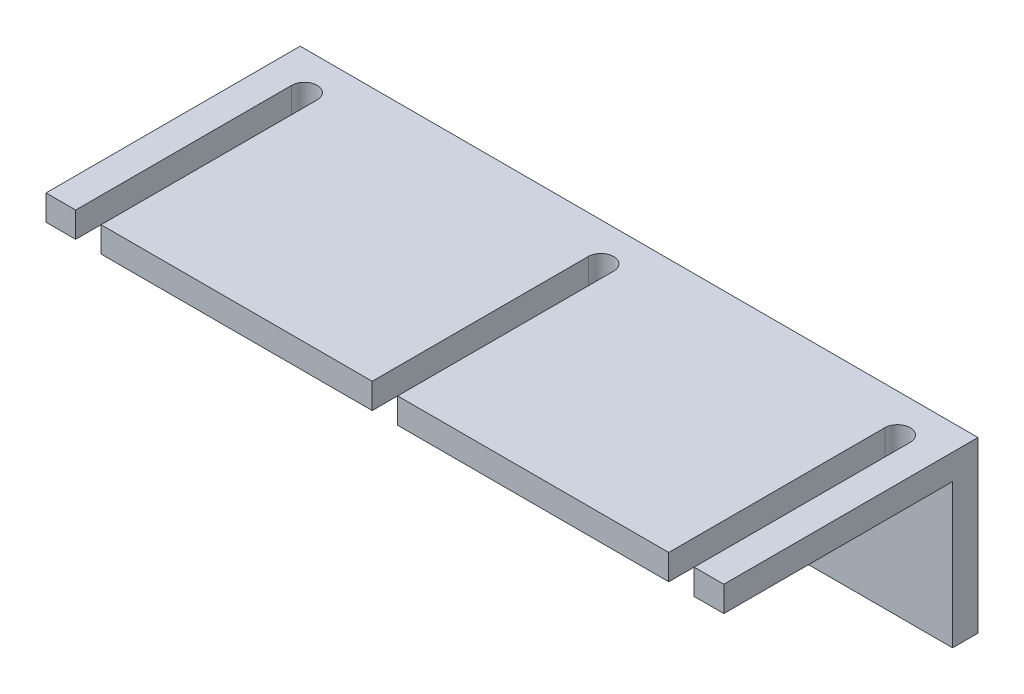
ISO-10303-21;
HEADER;
FILE_DESCRIPTION(('STEP AP214'),'2;1');
FILE_NAME('part.step','',(''),(''),'','','');
FILE_SCHEMA(('AUTOMOTIVE_DESIGN { 1 0 10303 214 1 1 1 1 }'));
ENDSEC;
DATA;
#1=APPLICATION_CONTEXT('core data for automotive mechanical design processes');
#2=APPLICATION_PROTOCOL_DEFINITION('international standard','automotive_design',2000,#1);
#3=PRODUCT_CONTEXT('',#1,'mechanical');
#4=PRODUCT('Part','Part','',(#3));
#5=PRODUCT_RELATED_PRODUCT_CATEGORY('part','',(#4));
#6=PRODUCT_DEFINITION_FORMATION('','',#4);
#7=PRODUCT_DEFINITION_CONTEXT('part definition',#1,'design');
#8=PRODUCT_DEFINITION('design','',#6,#7);
#9=PRODUCT_DEFINITION_SHAPE('','',#8);
#10=(LENGTH_UNIT() NAMED_UNIT(*) SI_UNIT(.MILLI.,.METRE.));
#11=(NAMED_UNIT(*) PLANE_ANGLE_UNIT() SI_UNIT($,.RADIAN.));
#12=(NAMED_UNIT(*) SI_UNIT($,.STERADIAN.) SOLID_ANGLE_UNIT());
#13=UNCERTAINTY_MEASURE_WITH_UNIT(LENGTH_MEASURE(1.E-05),#10,'distance_accuracy_value','');
#14=(GEOMETRIC_REPRESENTATION_CONTEXT(3) GLOBAL_UNCERTAINTY_ASSIGNED_CONTEXT((#13)) GLOBAL_UNIT_ASSIGNED_CONTEXT((#10,
#11,#12)) REPRESENTATION_CONTEXT('',''));
#15=CARTESIAN_POINT('',(0.,0.,0.));
#16=DIRECTION('',(0.,0.,1.));
#17=DIRECTION('',(1.,0.,0.));
#18=AXIS2_PLACEMENT_3D('',#15,#16,#17);
#19=CARTESIAN_POINT('',(-40.,10.,3.));
#20=DIRECTION('',(0.,-1.,0.));
#21=DIRECTION('',(0.,0.,-1.));
#22=AXIS2_PLACEMENT_3D('',#19,#20,#21);
#23=PLANE('',#22);
#24=DIRECTION('',(0.,0.,1.));
#25=VECTOR('',#24,1.);
#26=CARTESIAN_POINT('',(-33.5,10.,0.));
#27=LINE('',#26,#25);
#28=CARTESIAN_POINT('',(-33.5,10.,4.50000000000001));
#29=VERTEX_POINT('',#28);
#30=CARTESIAN_POINT('',(-33.5,10.,30.));
#31=VERTEX_POINT('',#30);
#32=EDGE_CURVE('E211',#29,#31,#27,.T.);
#33=ORIENTED_EDGE('',*,*,#32,.T.);
#34=DIRECTION('',(1.,0.,0.));
#35=VECTOR('',#34,1.);
#36=CARTESIAN_POINT('',(-40.,10.,30.));
#37=LINE('',#36,#35);
#38=CARTESIAN_POINT('',(-1.5,10.,30.));
#39=VERTEX_POINT('',#38);
#40=EDGE_CURVE('E250',#31,#39,#37,.T.);
#41=ORIENTED_EDGE('',*,*,#40,.T.);
#42=DIRECTION('',(0.,0.,1.));
#43=VECTOR('',#42,1.);
#44=CARTESIAN_POINT('',(-1.5,10.,0.));
#45=LINE('',#44,#43);
#46=CARTESIAN_POINT('',(-1.5,10.,4.50000000000001));
#47=VERTEX_POINT('',#46);
#48=EDGE_CURVE('E223',#47,#39,#45,.T.);
#49=ORIENTED_EDGE('',*,*,#48,.F.);
#50=CARTESIAN_POINT('',(0.,10.,4.50000000000001));
#51=DIRECTION('',(0.,1.,0.));
#52=DIRECTION('',(0.,0.,1.));
#53=AXIS2_PLACEMENT_3D('',#50,#51,#52);
#54=CIRCLE('',#53,1.5);
#55=CARTESIAN_POINT('',(1.5,10.,4.50000000000001));
#56=VERTEX_POINT('',#55);
#57=EDGE_CURVE('E201',#47,#56,#54,.F.);
#58=ORIENTED_EDGE('',*,*,#57,.T.);
#59=DIRECTION('',(0.,0.,-1.));
#60=VECTOR('',#59,1.);
#61=CARTESIAN_POINT('',(1.5,10.,0.));
#62=LINE('',#61,#60);
#63=CARTESIAN_POINT('',(1.5,10.,30.));
#64=VERTEX_POINT('',#63);
#65=EDGE_CURVE('E225',#64,#56,#62,.T.);
#66=ORIENTED_EDGE('',*,*,#65,.F.);
#67=CARTESIAN_POINT('',(33.5,10.,30.));
#68=VERTEX_POINT('',#67);
#69=EDGE_CURVE('E196',#64,#68,#37,.T.);
#70=ORIENTED_EDGE('',*,*,#69,.T.);
#71=DIRECTION('',(0.,0.,-1.));
#72=VECTOR('',#71,1.);
#73=CARTESIAN_POINT('',(33.5,10.,0.));
#74=LINE('',#73,#72);
#75=CARTESIAN_POINT('',(33.5,10.,4.50000000000001));
#76=VERTEX_POINT('',#75);
#77=EDGE_CURVE('E176',#68,#76,#74,.T.);
#78=ORIENTED_EDGE('',*,*,#77,.T.);
#79=CARTESIAN_POINT('',(35.,10.,4.50000000000001));
#80=DIRECTION('',(0.,1.,0.));
#81=DIRECTION('',(0.,0.,1.));
#82=AXIS2_PLACEMENT_3D('',#79,#80,#81);
#83=CIRCLE('',#82,1.5);
#84=CARTESIAN_POINT('',(36.5,10.,4.50000000000001));
#85=VERTEX_POINT('',#84);
#86=EDGE_CURVE('E183',#76,#85,#83,.F.);
#87=ORIENTED_EDGE('',*,*,#86,.T.);
#88=DIRECTION('',(0.,0.,1.));
#89=VECTOR('',#88,1.);
#90=CARTESIAN_POINT('',(36.5,10.,0.));
#91=LINE('',#90,#89);
#92=CARTESIAN_POINT('',(36.5,10.,30.));
#93=VERTEX_POINT('',#92);
#94=EDGE_CURVE('E180',#85,#93,#91,.T.);
#95=ORIENTED_EDGE('',*,*,#94,.T.);
#96=CARTESIAN_POINT('',(40.,10.,30.));
#97=VERTEX_POINT('',#96);
#98=EDGE_CURVE('E231',#93,#97,#37,.T.);
#99=ORIENTED_EDGE('',*,*,#98,.T.);
#100=DIRECTION('',(0.,0.,-1.));
#101=VECTOR('',#100,1.);
#102=CARTESIAN_POINT('',(40.,10.,3.));
#103=LINE('',#102,#101);
#104=CARTESIAN_POINT('',(40.,10.,0.));
#105=VERTEX_POINT('',#104);
#106=EDGE_CURVE('E296',#97,#105,#103,.T.);
#107=ORIENTED_EDGE('',*,*,#106,.T.);
#108=DIRECTION('',(-1.,0.,0.));
#109=VECTOR('',#108,1.);
#110=CARTESIAN_POINT('',(-40.,10.,0.));
#111=LINE('',#110,#109);
#112=CARTESIAN_POINT('',(-40.,10.,0.));
#113=VERTEX_POINT('',#112);
#114=EDGE_CURVE('E283',#105,#113,#111,.T.);
#115=ORIENTED_EDGE('',*,*,#114,.T.);
#116=DIRECTION('',(0.,0.,-1.));
#117=VECTOR('',#116,1.);
#118=CARTESIAN_POINT('',(-40.,10.,3.));
#119=LINE('',#118,#117);
#120=CARTESIAN_POINT('',(-40.,10.,30.));
#121=VERTEX_POINT('',#120);
#122=EDGE_CURVE('E293',#121,#113,#119,.T.);
#123=ORIENTED_EDGE('',*,*,#122,.F.);
#124=CARTESIAN_POINT('',(-36.5,10.,30.));
#125=VERTEX_POINT('',#124);
#126=EDGE_CURVE('E239',#121,#125,#37,.T.);
#127=ORIENTED_EDGE('',*,*,#126,.T.);
#128=DIRECTION('',(0.,0.,-1.));
#129=VECTOR('',#128,1.);
#130=CARTESIAN_POINT('',(-36.5,10.,0.));
#131=LINE('',#130,#129);
#132=CARTESIAN_POINT('',(-36.5,10.,4.50000000000001));
#133=VERTEX_POINT('',#132);
#134=EDGE_CURVE('E208',#125,#133,#131,.T.);
#135=ORIENTED_EDGE('',*,*,#134,.T.);
#136=CARTESIAN_POINT('',(-35.,10.,4.50000000000001));
#137=DIRECTION('',(0.,1.,0.));
#138=DIRECTION('',(0.,0.,1.));
#139=AXIS2_PLACEMENT_3D('',#136,#137,#138);
#140=CIRCLE('',#139,1.5);
#141=EDGE_CURVE('E205',#133,#29,#140,.F.);
#142=ORIENTED_EDGE('',*,*,#141,.T.);
#143=EDGE_LOOP('',(#33,#41,#49,#58,#66,#70,#78,#87,#95,#99,#107,#115,#123,#127,#135,#142));
#144=FACE_BOUND('',#143,.T.);
#145=ADVANCED_FACE('F41',(#144),#23,.F.);
#146=CARTESIAN_POINT('',(-40.,7.,30.));
#147=DIRECTION('',(0.,0.,1.));
#148=DIRECTION('',(1.,0.,0.));
#149=AXIS2_PLACEMENT_3D('',#146,#147,#148);
#150=PLANE('',#149);
#151=ORIENTED_EDGE('',*,*,#40,.F.);
#152=DIRECTION('',(0.,1.,0.));
#153=VECTOR('',#152,1.);
#154=CARTESIAN_POINT('',(-33.5,-10.,30.));
#155=LINE('',#154,#153);
#156=CARTESIAN_POINT('',(-33.5,7.,30.));
#157=VERTEX_POINT('',#156);
#158=EDGE_CURVE('E215',#157,#31,#155,.T.);
#159=ORIENTED_EDGE('',*,*,#158,.F.);
#160=DIRECTION('',(1.,0.,0.));
#161=VECTOR('',#160,1.);
#162=CARTESIAN_POINT('',(-40.,7.,30.));
#163=LINE('',#162,#161);
#164=CARTESIAN_POINT('',(-1.49999999999999,7.,30.));
#165=VERTEX_POINT('',#164);
#166=EDGE_CURVE('E244',#157,#165,#163,.T.);
#167=ORIENTED_EDGE('',*,*,#166,.T.);
#168=DIRECTION('',(0.,1.,0.));
#169=VECTOR('',#168,1.);
#170=CARTESIAN_POINT('',(-1.5,-10.,30.));
#171=LINE('',#170,#169);
#172=EDGE_CURVE('E64',#165,#39,#171,.T.);
#173=ORIENTED_EDGE('',*,*,#172,.T.);
#174=EDGE_LOOP('',(#151,#159,#167,#173));
#175=FACE_BOUND('',#174,.T.);
#176=ADVANCED_FACE('F374',(#175),#150,.T.);
#177=CARTESIAN_POINT('',(-40.,7.,30.));
#178=VERTEX_POINT('',#177);
#179=CARTESIAN_POINT('',(-36.5,7.,30.));
#180=VERTEX_POINT('',#179);
#181=EDGE_CURVE('E240',#178,#180,#163,.T.);
#182=ORIENTED_EDGE('',*,*,#181,.T.);
#183=DIRECTION('',(0.,1.,0.));
#184=VECTOR('',#183,1.);
#185=CARTESIAN_POINT('',(-36.5,-10.,30.));
#186=LINE('',#185,#184);
#187=EDGE_CURVE('E217',#180,#125,#186,.T.);
#188=ORIENTED_EDGE('',*,*,#187,.T.);
#189=ORIENTED_EDGE('',*,*,#126,.F.);
#190=DIRECTION('',(0.,1.,0.));
#191=VECTOR('',#190,1.);
#192=CARTESIAN_POINT('',(-40.,7.,30.));
#193=LINE('',#192,#191);
#194=EDGE_CURVE('E247',#178,#121,#193,.T.);
#195=ORIENTED_EDGE('',*,*,#194,.F.);
#196=EDGE_LOOP('',(#182,#188,#189,#195));
#197=FACE_BOUND('',#196,.T.);
#198=ADVANCED_FACE('F376',(#197),#150,.T.);
#199=ORIENTED_EDGE('',*,*,#98,.F.);
#200=DIRECTION('',(0.,1.,0.));
#201=VECTOR('',#200,1.);
#202=CARTESIAN_POINT('',(36.5,-10.,30.));
#203=LINE('',#202,#201);
#204=CARTESIAN_POINT('',(36.5,7.,30.));
#205=VERTEX_POINT('',#204);
#206=EDGE_CURVE('E202',#205,#93,#203,.T.);
#207=ORIENTED_EDGE('',*,*,#206,.F.);
#208=CARTESIAN_POINT('',(40.,7.,30.));
#209=VERTEX_POINT('',#208);
#210=EDGE_CURVE('E238',#205,#209,#163,.T.);
#211=ORIENTED_EDGE('',*,*,#210,.T.);
#212=DIRECTION('',(0.,1.,0.));
#213=VECTOR('',#212,1.);
#214=CARTESIAN_POINT('',(40.,7.,30.));
#215=LINE('',#214,#213);
#216=EDGE_CURVE('E251',#209,#97,#215,.T.);
#217=ORIENTED_EDGE('',*,*,#216,.T.);
#218=EDGE_LOOP('',(#199,#207,#211,#217));
#219=FACE_BOUND('',#218,.T.);
#220=ADVANCED_FACE('F345',(#219),#150,.T.);
#221=CARTESIAN_POINT('',(1.5,7.,30.));
#222=VERTEX_POINT('',#221);
#223=CARTESIAN_POINT('',(33.5,7.,30.));
#224=VERTEX_POINT('',#223);
#225=EDGE_CURVE('E335',#222,#224,#163,.T.);
#226=ORIENTED_EDGE('',*,*,#225,.T.);
#227=DIRECTION('',(0.,1.,0.));
#228=VECTOR('',#227,1.);
#229=CARTESIAN_POINT('',(33.5,-10.,30.));
#230=LINE('',#229,#228);
#231=EDGE_CURVE('E56',#224,#68,#230,.T.);
#232=ORIENTED_EDGE('',*,*,#231,.T.);
#233=ORIENTED_EDGE('',*,*,#69,.F.);
#234=DIRECTION('',(0.,1.,0.));
#235=VECTOR('',#234,1.);
#236=CARTESIAN_POINT('',(1.5,-10.,30.));
#237=LINE('',#236,#235);
#238=EDGE_CURVE('E232',#222,#64,#237,.T.);
#239=ORIENTED_EDGE('',*,*,#238,.F.);
#240=EDGE_LOOP('',(#226,#232,#233,#239));
#241=FACE_BOUND('',#240,.T.);
#242=ADVANCED_FACE('F378',(#241),#150,.T.);
#243=CARTESIAN_POINT('',(0.,7.,0.));
#244=DIRECTION('',(0.,1.,0.));
#245=DIRECTION('',(0.,0.,1.));
#246=AXIS2_PLACEMENT_3D('',#243,#244,#245);
#247=PLANE('',#246);
#248=DIRECTION('',(0.,0.,1.));
#249=VECTOR('',#248,1.);
#250=CARTESIAN_POINT('',(-33.5,7.,0.));
#251=LINE('',#250,#249);
#252=CARTESIAN_POINT('',(-33.5,7.,4.50000000000001));
#253=VERTEX_POINT('',#252);
#254=EDGE_CURVE('E11',#253,#157,#251,.T.);
#255=ORIENTED_EDGE('',*,*,#254,.F.);
#256=CARTESIAN_POINT('',(-35.,7.,4.50000000000001));
#257=DIRECTION('',(0.,1.,0.));
#258=DIRECTION('',(0.,0.,1.));
#259=AXIS2_PLACEMENT_3D('',#256,#257,#258);
#260=CIRCLE('',#259,1.5);
#261=CARTESIAN_POINT('',(-35.,7.,3.));
#262=VERTEX_POINT('',#261);
#263=EDGE_CURVE('E49',#262,#253,#260,.F.);
#264=ORIENTED_EDGE('',*,*,#263,.F.);
#265=DIRECTION('',(-1.,0.,0.));
#266=VECTOR('',#265,1.);
#267=CARTESIAN_POINT('',(0.,7.,3.));
#268=LINE('',#267,#266);
#269=CARTESIAN_POINT('',(0.,7.,3.));
#270=VERTEX_POINT('',#269);
#271=EDGE_CURVE('E614',#270,#262,#268,.T.);
#272=ORIENTED_EDGE('',*,*,#271,.F.);
#273=CARTESIAN_POINT('',(0.,7.,4.50000000000001));
#274=DIRECTION('',(0.,1.,0.));
#275=DIRECTION('',(0.,0.,1.));
#276=AXIS2_PLACEMENT_3D('',#273,#274,#275);
#277=CIRCLE('',#276,1.5);
#278=CARTESIAN_POINT('',(-1.5,7.,4.50000000000001));
#279=VERTEX_POINT('',#278);
#280=EDGE_CURVE('E301',#279,#270,#277,.F.);
#281=ORIENTED_EDGE('',*,*,#280,.F.);
#282=DIRECTION('',(0.,0.,1.));
#283=VECTOR('',#282,1.);
#284=CARTESIAN_POINT('',(-1.5,7.,0.));
#285=LINE('',#284,#283);
#286=EDGE_CURVE('E299',#279,#165,#285,.T.);
#287=ORIENTED_EDGE('',*,*,#286,.T.);
#288=ORIENTED_EDGE('',*,*,#166,.F.);
#289=EDGE_LOOP('',(#255,#264,#272,#281,#287,#288));
#290=FACE_BOUND('',#289,.T.);
#291=ADVANCED_FACE('F331',(#290),#247,.F.);
#292=CARTESIAN_POINT('',(-36.5,7.,4.50000000000001));
#293=VERTEX_POINT('',#292);
#294=EDGE_CURVE('E314',#293,#262,#260,.F.);
#295=ORIENTED_EDGE('',*,*,#294,.F.);
#296=DIRECTION('',(0.,0.,-1.));
#297=VECTOR('',#296,1.);
#298=CARTESIAN_POINT('',(-36.5,7.,0.));
#299=LINE('',#298,#297);
#300=EDGE_CURVE('E313',#180,#293,#299,.T.);
#301=ORIENTED_EDGE('',*,*,#300,.F.);
#302=ORIENTED_EDGE('',*,*,#181,.F.);
#303=DIRECTION('',(0.,0.,1.));
#304=VECTOR('',#303,1.);
#305=CARTESIAN_POINT('',(-40.,7.,0.));
#306=LINE('',#305,#304);
#307=CARTESIAN_POINT('',(-40.,7.,3.));
#308=VERTEX_POINT('',#307);
#309=EDGE_CURVE('E236',#308,#178,#306,.T.);
#310=ORIENTED_EDGE('',*,*,#309,.F.);
#311=EDGE_CURVE('E254',#262,#308,#268,.T.);
#312=ORIENTED_EDGE('',*,*,#311,.F.);
#313=EDGE_LOOP('',(#295,#301,#302,#310,#312));
#314=FACE_BOUND('',#313,.T.);
#315=ADVANCED_FACE('F391',(#314),#247,.F.);
#316=DIRECTION('',(0.,0.,1.));
#317=VECTOR('',#316,1.);
#318=CARTESIAN_POINT('',(36.5,7.,0.));
#319=LINE('',#318,#317);
#320=CARTESIAN_POINT('',(36.5,7.,4.50000000000001));
#321=VERTEX_POINT('',#320);
#322=EDGE_CURVE('E311',#321,#205,#319,.T.);
#323=ORIENTED_EDGE('',*,*,#322,.F.);
#324=CARTESIAN_POINT('',(35.,7.,4.50000000000001));
#325=DIRECTION('',(0.,1.,0.));
#326=DIRECTION('',(0.,0.,1.));
#327=AXIS2_PLACEMENT_3D('',#324,#325,#326);
#328=CIRCLE('',#327,1.5);
#329=CARTESIAN_POINT('',(35.,7.,3.));
#330=VERTEX_POINT('',#329);
#331=EDGE_CURVE('E310',#330,#321,#328,.F.);
#332=ORIENTED_EDGE('',*,*,#331,.F.);
#333=CARTESIAN_POINT('',(40.,7.,3.));
#334=VERTEX_POINT('',#333);
#335=EDGE_CURVE('E257',#334,#330,#268,.T.);
#336=ORIENTED_EDGE('',*,*,#335,.F.);
#337=DIRECTION('',(0.,0.,-1.));
#338=VECTOR('',#337,1.);
#339=CARTESIAN_POINT('',(40.,7.,0.));
#340=LINE('',#339,#338);
#341=EDGE_CURVE('E243',#209,#334,#340,.T.);
#342=ORIENTED_EDGE('',*,*,#341,.F.);
#343=ORIENTED_EDGE('',*,*,#210,.F.);
#344=EDGE_LOOP('',(#323,#332,#336,#342,#343));
#345=FACE_BOUND('',#344,.T.);
#346=ADVANCED_FACE('F353',(#345),#247,.F.);
#347=CARTESIAN_POINT('',(33.5,7.,4.50000000000001));
#348=VERTEX_POINT('',#347);
#349=EDGE_CURVE('E308',#348,#330,#328,.F.);
#350=ORIENTED_EDGE('',*,*,#349,.F.);
#351=DIRECTION('',(0.,0.,-1.));
#352=VECTOR('',#351,1.);
#353=CARTESIAN_POINT('',(33.5,7.,0.));
#354=LINE('',#353,#352);
#355=EDGE_CURVE('E177',#224,#348,#354,.T.);
#356=ORIENTED_EDGE('',*,*,#355,.F.);
#357=ORIENTED_EDGE('',*,*,#225,.F.);
#358=DIRECTION('',(0.,0.,-1.));
#359=VECTOR('',#358,1.);
#360=CARTESIAN_POINT('',(1.5,7.,0.));
#361=LINE('',#360,#359);
#362=CARTESIAN_POINT('',(1.5,7.,4.50000000000001));
#363=VERTEX_POINT('',#362);
#364=EDGE_CURVE('E304',#222,#363,#361,.T.);
#365=ORIENTED_EDGE('',*,*,#364,.T.);
#366=EDGE_CURVE('E303',#270,#363,#277,.F.);
#367=ORIENTED_EDGE('',*,*,#366,.F.);
#368=EDGE_CURVE('E261',#330,#270,#268,.T.);
#369=ORIENTED_EDGE('',*,*,#368,.F.);
#370=EDGE_LOOP('',(#350,#356,#357,#365,#367,#369));
#371=FACE_BOUND('',#370,.T.);
#372=ADVANCED_FACE('F392',(#371),#247,.F.);
#373=CARTESIAN_POINT('',(0.,0.,3.));
#374=DIRECTION('',(0.,0.,1.));
#375=DIRECTION('',(1.,0.,0.));
#376=AXIS2_PLACEMENT_3D('',#373,#374,#375);
#377=PLANE('',#376);
#378=DIRECTION('',(1.,0.,0.));
#379=VECTOR('',#378,1.);
#380=CARTESIAN_POINT('',(-40.,-10.,3.));
#381=LINE('',#380,#379);
#382=CARTESIAN_POINT('',(-40.,-10.,3.));
#383=VERTEX_POINT('',#382);
#384=CARTESIAN_POINT('',(40.,-10.,3.));
#385=VERTEX_POINT('',#384);
#386=EDGE_CURVE('E279',#383,#385,#381,.T.);
#387=ORIENTED_EDGE('',*,*,#386,.T.);
#388=DIRECTION('',(0.,1.,0.));
#389=VECTOR('',#388,1.);
#390=CARTESIAN_POINT('',(40.,10.,3.));
#391=LINE('',#390,#389);
#392=EDGE_CURVE('E274',#385,#334,#391,.T.);
#393=ORIENTED_EDGE('',*,*,#392,.T.);
#394=ORIENTED_EDGE('',*,*,#335,.T.);
#395=ORIENTED_EDGE('',*,*,#368,.T.);
#396=ORIENTED_EDGE('',*,*,#271,.T.);
#397=ORIENTED_EDGE('',*,*,#311,.T.);
#398=DIRECTION('',(0.,-1.,0.));
#399=VECTOR('',#398,1.);
#400=CARTESIAN_POINT('',(-40.,10.,3.));
#401=LINE('',#400,#399);
#402=EDGE_CURVE('E276',#308,#383,#401,.T.);
#403=ORIENTED_EDGE('',*,*,#402,.T.);
#404=EDGE_LOOP('',(#387,#393,#394,#395,#396,#397,#403));
#405=FACE_BOUND('',#404,.T.);
#406=CARTESIAN_POINT('',(20.,0.,3.));
#407=DIRECTION('',(0.,0.,1.));
#408=DIRECTION('',(1.,0.,0.));
#409=AXIS2_PLACEMENT_3D('',#406,#407,#408);
#410=CIRCLE('',#409,2.99999999999999);
#411=CARTESIAN_POINT('',(23.,0.,3.));
#412=VERTEX_POINT('',#411);
#413=EDGE_CURVE('E268',#412,#412,#410,.T.);
#414=ORIENTED_EDGE('',*,*,#413,.F.);
#415=EDGE_LOOP('',(#414));
#416=FACE_BOUND('',#415,.T.);
#417=CARTESIAN_POINT('',(-20.,0.,3.));
#418=DIRECTION('',(0.,0.,1.));
#419=DIRECTION('',(1.,0.,0.));
#420=AXIS2_PLACEMENT_3D('',#417,#418,#419);
#421=CIRCLE('',#420,2.99999999999999);
#422=CARTESIAN_POINT('',(-17.,0.,3.));
#423=VERTEX_POINT('',#422);
#424=EDGE_CURVE('E262',#423,#423,#421,.T.);
#425=ORIENTED_EDGE('',*,*,#424,.F.);
#426=EDGE_LOOP('',(#425));
#427=FACE_BOUND('',#426,.T.);
#428=ADVANCED_FACE('F358',(#405,#416,#427),#377,.T.);
#429=CARTESIAN_POINT('',(0.,0.,0.));
#430=DIRECTION('',(0.,0.,1.));
#431=DIRECTION('',(1.,0.,0.));
#432=AXIS2_PLACEMENT_3D('',#429,#430,#431);
#433=PLANE('',#432);
#434=ORIENTED_EDGE('',*,*,#114,.F.);
#435=DIRECTION('',(0.,1.,0.));
#436=VECTOR('',#435,1.);
#437=CARTESIAN_POINT('',(40.,10.,0.));
#438=LINE('',#437,#436);
#439=CARTESIAN_POINT('',(40.,-10.,0.));
#440=VERTEX_POINT('',#439);
#441=EDGE_CURVE('E271',#440,#105,#438,.T.);
#442=ORIENTED_EDGE('',*,*,#441,.F.);
#443=DIRECTION('',(1.,0.,0.));
#444=VECTOR('',#443,1.);
#445=CARTESIAN_POINT('',(-40.,-10.,0.));
#446=LINE('',#445,#444);
#447=CARTESIAN_POINT('',(-40.,-10.,0.));
#448=VERTEX_POINT('',#447);
#449=EDGE_CURVE('E277',#448,#440,#446,.T.);
#450=ORIENTED_EDGE('',*,*,#449,.F.);
#451=DIRECTION('',(0.,-1.,0.));
#452=VECTOR('',#451,1.);
#453=CARTESIAN_POINT('',(-40.,10.,0.));
#454=LINE('',#453,#452);
#455=EDGE_CURVE('E285',#113,#448,#454,.T.);
#456=ORIENTED_EDGE('',*,*,#455,.F.);
#457=EDGE_LOOP('',(#434,#442,#450,#456));
#458=FACE_BOUND('',#457,.T.);
#459=CARTESIAN_POINT('',(-20.,0.,0.));
#460=DIRECTION('',(0.,0.,1.));
#461=DIRECTION('',(1.,0.,0.));
#462=AXIS2_PLACEMENT_3D('',#459,#460,#461);
#463=CIRCLE('',#462,2.99999999999999);
#464=CARTESIAN_POINT('',(-17.,0.,0.));
#465=VERTEX_POINT('',#464);
#466=EDGE_CURVE('E260',#465,#465,#463,.T.);
#467=ORIENTED_EDGE('',*,*,#466,.T.);
#468=EDGE_LOOP('',(#467));
#469=FACE_BOUND('',#468,.T.);
#470=CARTESIAN_POINT('',(20.,0.,0.));
#471=DIRECTION('',(0.,0.,1.));
#472=DIRECTION('',(1.,0.,0.));
#473=AXIS2_PLACEMENT_3D('',#470,#471,#472);
#474=CIRCLE('',#473,2.99999999999999);
#475=CARTESIAN_POINT('',(23.,0.,0.));
#476=VERTEX_POINT('',#475);
#477=EDGE_CURVE('E265',#476,#476,#474,.T.);
#478=ORIENTED_EDGE('',*,*,#477,.T.);
#479=EDGE_LOOP('',(#478));
#480=FACE_BOUND('',#479,.T.);
#481=ADVANCED_FACE('F368',(#458,#469,#480),#433,.F.);
#482=CARTESIAN_POINT('',(40.,10.,3.));
#483=DIRECTION('',(-1.,0.,0.));
#484=DIRECTION('',(0.,-1.,0.));
#485=AXIS2_PLACEMENT_3D('',#482,#483,#484);
#486=PLANE('',#485);
#487=ORIENTED_EDGE('',*,*,#106,.F.);
#488=ORIENTED_EDGE('',*,*,#216,.F.);
#489=ORIENTED_EDGE('',*,*,#341,.T.);
#490=ORIENTED_EDGE('',*,*,#392,.F.);
#491=DIRECTION('',(0.,0.,-1.));
#492=VECTOR('',#491,1.);
#493=CARTESIAN_POINT('',(40.,-10.,3.));
#494=LINE('',#493,#492);
#495=EDGE_CURVE('E281',#385,#440,#494,.T.);
#496=ORIENTED_EDGE('',*,*,#495,.T.);
#497=ORIENTED_EDGE('',*,*,#441,.T.);
#498=EDGE_LOOP('',(#487,#488,#489,#490,#496,#497));
#499=FACE_BOUND('',#498,.T.);
#500=ADVANCED_FACE('F43',(#499),#486,.F.);
#501=CARTESIAN_POINT('',(-40.,10.,3.));
#502=DIRECTION('',(1.,0.,0.));
#503=DIRECTION('',(0.,0.,-1.));
#504=AXIS2_PLACEMENT_3D('',#501,#502,#503);
#505=PLANE('',#504);
#506=ORIENTED_EDGE('',*,*,#455,.T.);
#507=DIRECTION('',(0.,0.,-1.));
#508=VECTOR('',#507,1.);
#509=CARTESIAN_POINT('',(-40.,-10.,3.));
#510=LINE('',#509,#508);
#511=EDGE_CURVE('E290',#383,#448,#510,.T.);
#512=ORIENTED_EDGE('',*,*,#511,.F.);
#513=ORIENTED_EDGE('',*,*,#402,.F.);
#514=ORIENTED_EDGE('',*,*,#309,.T.);
#515=ORIENTED_EDGE('',*,*,#194,.T.);
#516=ORIENTED_EDGE('',*,*,#122,.T.);
#517=EDGE_LOOP('',(#506,#512,#513,#514,#515,#516));
#518=FACE_BOUND('',#517,.T.);
#519=ADVANCED_FACE('F504',(#518),#505,.F.);
#520=CARTESIAN_POINT('',(-40.,-10.,3.));
#521=DIRECTION('',(0.,1.,0.));
#522=DIRECTION('',(0.,0.,1.));
#523=AXIS2_PLACEMENT_3D('',#520,#521,#522);
#524=PLANE('',#523);
#525=ORIENTED_EDGE('',*,*,#449,.T.);
#526=ORIENTED_EDGE('',*,*,#495,.F.);
#527=ORIENTED_EDGE('',*,*,#386,.F.);
#528=ORIENTED_EDGE('',*,*,#511,.T.);
#529=EDGE_LOOP('',(#525,#526,#527,#528));
#530=FACE_BOUND('',#529,.T.);
#531=ADVANCED_FACE('F499',(#530),#524,.F.);
#532=CARTESIAN_POINT('',(20.,0.,3.));
#533=DIRECTION('',(0.,0.,-1.));
#534=DIRECTION('',(-1.,0.,0.));
#535=AXIS2_PLACEMENT_3D('',#532,#533,#534);
#536=CYLINDRICAL_SURFACE('',#535,2.99999999999999);
#537=ORIENTED_EDGE('',*,*,#413,.T.);
#538=EDGE_LOOP('',(#537));
#539=FACE_BOUND('',#538,.T.);
#540=ORIENTED_EDGE('',*,*,#477,.F.);
#541=EDGE_LOOP('',(#540));
#542=FACE_BOUND('',#541,.T.);
#543=ADVANCED_FACE('F503',(#539,#542),#536,.F.);
#544=CARTESIAN_POINT('',(-20.,0.,3.));
#545=DIRECTION('',(0.,0.,-1.));
#546=DIRECTION('',(-1.,0.,0.));
#547=AXIS2_PLACEMENT_3D('',#544,#545,#546);
#548=CYLINDRICAL_SURFACE('',#547,2.99999999999999);
#549=ORIENTED_EDGE('',*,*,#424,.T.);
#550=EDGE_LOOP('',(#549));
#551=FACE_BOUND('',#550,.T.);
#552=ORIENTED_EDGE('',*,*,#466,.F.);
#553=EDGE_LOOP('',(#552));
#554=FACE_BOUND('',#553,.T.);
#555=ADVANCED_FACE('F423',(#551,#554),#548,.F.);
#556=CARTESIAN_POINT('',(0.,-10.,4.50000000000001));
#557=DIRECTION('',(0.,1.,0.));
#558=DIRECTION('',(0.,0.,1.));
#559=AXIS2_PLACEMENT_3D('',#556,#557,#558);
#560=CYLINDRICAL_SURFACE('',#559,1.5);
#561=ORIENTED_EDGE('',*,*,#280,.T.);
#562=ORIENTED_EDGE('',*,*,#366,.T.);
#563=DIRECTION('',(0.,1.,0.));
#564=VECTOR('',#563,1.);
#565=CARTESIAN_POINT('',(1.5,-10.,4.50000000000001));
#566=LINE('',#565,#564);
#567=EDGE_CURVE('E229',#363,#56,#566,.T.);
#568=ORIENTED_EDGE('',*,*,#567,.T.);
#569=ORIENTED_EDGE('',*,*,#57,.F.);
#570=DIRECTION('',(0.,1.,0.));
#571=VECTOR('',#570,1.);
#572=CARTESIAN_POINT('',(-1.5,-10.,4.50000000000001));
#573=LINE('',#572,#571);
#574=EDGE_CURVE('E228',#279,#47,#573,.T.);
#575=ORIENTED_EDGE('',*,*,#574,.F.);
#576=EDGE_LOOP('',(#561,#562,#568,#569,#575));
#577=FACE_BOUND('',#576,.T.);
#578=ADVANCED_FACE('F417',(#577),#560,.F.);
#579=CARTESIAN_POINT('',(1.5,-10.,0.));
#580=DIRECTION('',(1.,0.,0.));
#581=DIRECTION('',(0.,0.,-1.));
#582=AXIS2_PLACEMENT_3D('',#579,#580,#581);
#583=PLANE('',#582);
#584=ORIENTED_EDGE('',*,*,#238,.T.);
#585=ORIENTED_EDGE('',*,*,#65,.T.);
#586=ORIENTED_EDGE('',*,*,#567,.F.);
#587=ORIENTED_EDGE('',*,*,#364,.F.);
#588=EDGE_LOOP('',(#584,#585,#586,#587));
#589=FACE_BOUND('',#588,.T.);
#590=ADVANCED_FACE('F422',(#589),#583,.F.);
#591=CARTESIAN_POINT('',(-1.5,-10.,0.));
#592=DIRECTION('',(-1.,0.,0.));
#593=DIRECTION('',(0.,0.,1.));
#594=AXIS2_PLACEMENT_3D('',#591,#592,#593);
#595=PLANE('',#594);
#596=ORIENTED_EDGE('',*,*,#574,.T.);
#597=ORIENTED_EDGE('',*,*,#48,.T.);
#598=ORIENTED_EDGE('',*,*,#172,.F.);
#599=ORIENTED_EDGE('',*,*,#286,.F.);
#600=EDGE_LOOP('',(#596,#597,#598,#599));
#601=FACE_BOUND('',#600,.T.);
#602=ADVANCED_FACE('F432',(#601),#595,.F.);
#603=CARTESIAN_POINT('',(35.,-10.,4.50000000000001));
#604=DIRECTION('',(0.,1.,0.));
#605=DIRECTION('',(0.,0.,1.));
#606=AXIS2_PLACEMENT_3D('',#603,#604,#605);
#607=CYLINDRICAL_SURFACE('',#606,1.5);
#608=ORIENTED_EDGE('',*,*,#349,.T.);
#609=ORIENTED_EDGE('',*,*,#331,.T.);
#610=DIRECTION('',(0.,1.,0.));
#611=VECTOR('',#610,1.);
#612=CARTESIAN_POINT('',(36.5,-10.,4.50000000000001));
#613=LINE('',#612,#611);
#614=EDGE_CURVE('E186',#321,#85,#613,.T.);
#615=ORIENTED_EDGE('',*,*,#614,.T.);
#616=ORIENTED_EDGE('',*,*,#86,.F.);
#617=DIRECTION('',(0.,1.,0.));
#618=VECTOR('',#617,1.);
#619=CARTESIAN_POINT('',(33.5,-10.,4.50000000000001));
#620=LINE('',#619,#618);
#621=EDGE_CURVE('E172',#348,#76,#620,.T.);
#622=ORIENTED_EDGE('',*,*,#621,.F.);
#623=EDGE_LOOP('',(#608,#609,#615,#616,#622));
#624=FACE_BOUND('',#623,.T.);
#625=ADVANCED_FACE('F184',(#624),#607,.F.);
#626=CARTESIAN_POINT('',(36.5,-10.,0.));
#627=DIRECTION('',(-1.,0.,0.));
#628=DIRECTION('',(0.,0.,1.));
#629=AXIS2_PLACEMENT_3D('',#626,#627,#628);
#630=PLANE('',#629);
#631=ORIENTED_EDGE('',*,*,#322,.T.);
#632=ORIENTED_EDGE('',*,*,#206,.T.);
#633=ORIENTED_EDGE('',*,*,#94,.F.);
#634=ORIENTED_EDGE('',*,*,#614,.F.);
#635=EDGE_LOOP('',(#631,#632,#633,#634));
#636=FACE_BOUND('',#635,.T.);
#637=ADVANCED_FACE('F448',(#636),#630,.T.);
#638=CARTESIAN_POINT('',(33.5,-10.,0.));
#639=DIRECTION('',(1.,0.,0.));
#640=DIRECTION('',(0.,0.,-1.));
#641=AXIS2_PLACEMENT_3D('',#638,#639,#640);
#642=PLANE('',#641);
#643=ORIENTED_EDGE('',*,*,#355,.T.);
#644=ORIENTED_EDGE('',*,*,#621,.T.);
#645=ORIENTED_EDGE('',*,*,#77,.F.);
#646=ORIENTED_EDGE('',*,*,#231,.F.);
#647=EDGE_LOOP('',(#643,#644,#645,#646));
#648=FACE_BOUND('',#647,.T.);
#649=ADVANCED_FACE('F174',(#648),#642,.T.);
#650=CARTESIAN_POINT('',(-35.,-10.,4.50000000000001));
#651=DIRECTION('',(0.,1.,0.));
#652=DIRECTION('',(0.,0.,1.));
#653=AXIS2_PLACEMENT_3D('',#650,#651,#652);
#654=CYLINDRICAL_SURFACE('',#653,1.5);
#655=ORIENTED_EDGE('',*,*,#294,.T.);
#656=ORIENTED_EDGE('',*,*,#263,.T.);
#657=DIRECTION('',(0.,1.,0.));
#658=VECTOR('',#657,1.);
#659=CARTESIAN_POINT('',(-33.5,-10.,4.50000000000001));
#660=LINE('',#659,#658);
#661=EDGE_CURVE('E190',#253,#29,#660,.T.);
#662=ORIENTED_EDGE('',*,*,#661,.T.);
#663=ORIENTED_EDGE('',*,*,#141,.F.);
#664=DIRECTION('',(0.,1.,0.));
#665=VECTOR('',#664,1.);
#666=CARTESIAN_POINT('',(-36.5,-10.,4.50000000000001));
#667=LINE('',#666,#665);
#668=EDGE_CURVE('E213',#293,#133,#667,.T.);
#669=ORIENTED_EDGE('',*,*,#668,.F.);
#670=EDGE_LOOP('',(#655,#656,#662,#663,#669));
#671=FACE_BOUND('',#670,.T.);
#672=ADVANCED_FACE('F320',(#671),#654,.F.);
#673=CARTESIAN_POINT('',(-33.5,-10.,0.));
#674=DIRECTION('',(-1.,0.,0.));
#675=DIRECTION('',(0.,0.,1.));
#676=AXIS2_PLACEMENT_3D('',#673,#674,#675);
#677=PLANE('',#676);
#678=ORIENTED_EDGE('',*,*,#254,.T.);
#679=ORIENTED_EDGE('',*,*,#158,.T.);
#680=ORIENTED_EDGE('',*,*,#32,.F.);
#681=ORIENTED_EDGE('',*,*,#661,.F.);
#682=EDGE_LOOP('',(#678,#679,#680,#681));
#683=FACE_BOUND('',#682,.T.);
#684=ADVANCED_FACE('F328',(#683),#677,.T.);
#685=CARTESIAN_POINT('',(-36.5,-10.,0.));
#686=DIRECTION('',(1.,0.,0.));
#687=DIRECTION('',(0.,0.,-1.));
#688=AXIS2_PLACEMENT_3D('',#685,#686,#687);
#689=PLANE('',#688);
#690=ORIENTED_EDGE('',*,*,#300,.T.);
#691=ORIENTED_EDGE('',*,*,#668,.T.);
#692=ORIENTED_EDGE('',*,*,#134,.F.);
#693=ORIENTED_EDGE('',*,*,#187,.F.);
#694=EDGE_LOOP('',(#690,#691,#692,#693));
#695=FACE_BOUND('',#694,.T.);
#696=ADVANCED_FACE('F478',(#695),#689,.T.);
#697=CLOSED_SHELL('',(#145,#176,#198,#220,#242,#291,#315,#346,#372,#428,#481,#500,#519,#531,
#543,#555,#578,#590,#602,#625,#637,#649,#672,#684,#696));
#698=MANIFOLD_SOLID_BREP('B2',#697);
#699=ADVANCED_BREP_SHAPE_REPRESENTATION('',(#18,#698),#14);
#700=SHAPE_DEFINITION_REPRESENTATION(#9,#699);
ENDSEC;
END-ISO-10303-21;
